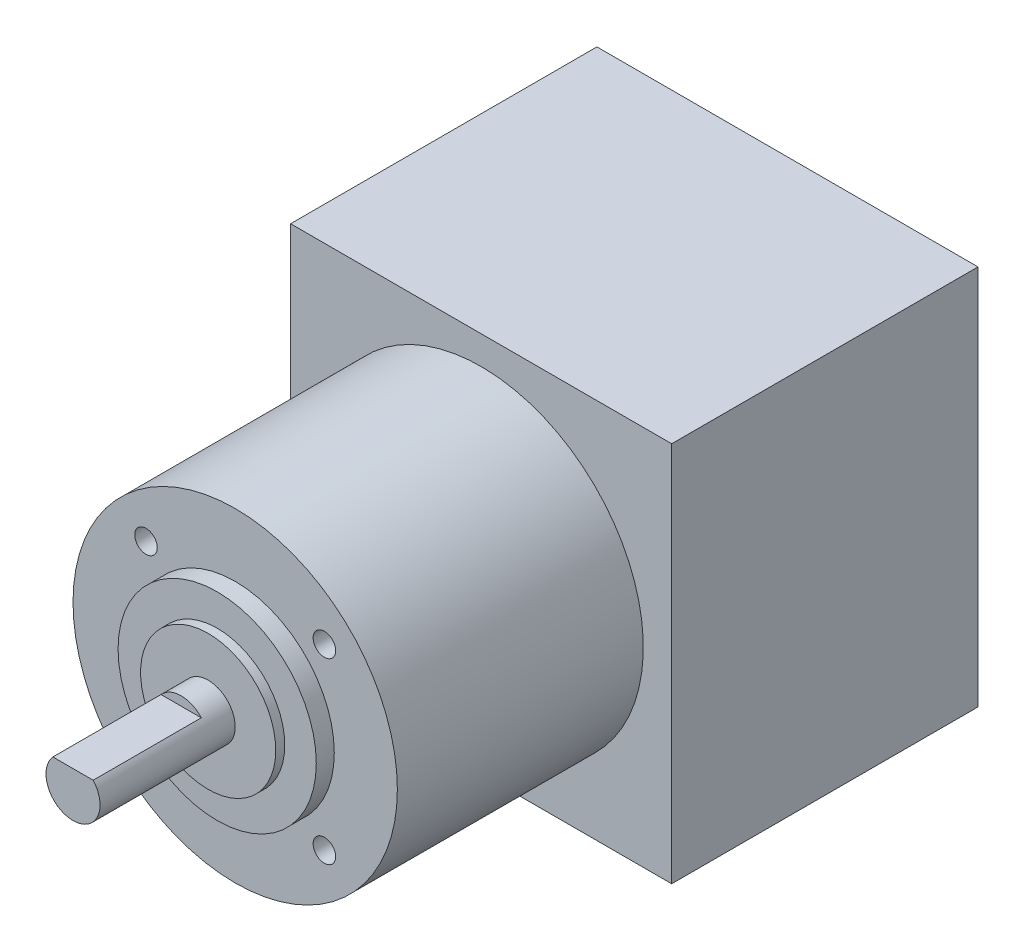
ISO-10303-21;
HEADER;
FILE_DESCRIPTION(('STEP AP214'),'2;1');
FILE_NAME('part.step','',(''),(''),'','','');
FILE_SCHEMA(('AUTOMOTIVE_DESIGN { 1 0 10303 214 1 1 1 1 }'));
ENDSEC;
DATA;
#1=APPLICATION_CONTEXT('core data for automotive mechanical design processes');
#2=APPLICATION_PROTOCOL_DEFINITION('international standard','automotive_design',2000,#1);
#3=PRODUCT_CONTEXT('',#1,'mechanical');
#4=PRODUCT('Part','Part','',(#3));
#5=PRODUCT_RELATED_PRODUCT_CATEGORY('part','',(#4));
#6=PRODUCT_DEFINITION_FORMATION('','',#4);
#7=PRODUCT_DEFINITION_CONTEXT('part definition',#1,'design');
#8=PRODUCT_DEFINITION('design','',#6,#7);
#9=PRODUCT_DEFINITION_SHAPE('','',#8);
#10=(LENGTH_UNIT() NAMED_UNIT(*) SI_UNIT(.MILLI.,.METRE.));
#11=(NAMED_UNIT(*) PLANE_ANGLE_UNIT() SI_UNIT($,.RADIAN.));
#12=(NAMED_UNIT(*) SI_UNIT($,.STERADIAN.) SOLID_ANGLE_UNIT());
#13=UNCERTAINTY_MEASURE_WITH_UNIT(LENGTH_MEASURE(1.E-05),#10,'distance_accuracy_value','');
#14=(GEOMETRIC_REPRESENTATION_CONTEXT(3) GLOBAL_UNCERTAINTY_ASSIGNED_CONTEXT((#13)) GLOBAL_UNIT_ASSIGNED_CONTEXT((#10,
#11,#12)) REPRESENTATION_CONTEXT('',''));
#15=CARTESIAN_POINT('',(0.,0.,0.));
#16=DIRECTION('',(0.,0.,1.));
#17=DIRECTION('',(1.,0.,0.));
#18=AXIS2_PLACEMENT_3D('',#15,#16,#17);
#19=CARTESIAN_POINT('',(0.,0.,34.));
#20=DIRECTION('',(0.,1.,0.));
#21=DIRECTION('',(0.,0.,1.));
#22=AXIS2_PLACEMENT_3D('',#19,#20,#21);
#23=PLANE('',#22);
#24=DIRECTION('',(1.,0.,0.));
#25=VECTOR('',#24,1.);
#26=CARTESIAN_POINT('',(0.,0.,0.));
#27=LINE('',#26,#25);
#28=CARTESIAN_POINT('',(0.,0.,0.));
#29=VERTEX_POINT('',#28);
#30=CARTESIAN_POINT('',(42.3,0.,0.));
#31=VERTEX_POINT('',#30);
#32=EDGE_CURVE('E190',#29,#31,#27,.T.);
#33=ORIENTED_EDGE('',*,*,#32,.T.);
#34=DIRECTION('',(0.,0.,-1.));
#35=VECTOR('',#34,1.);
#36=CARTESIAN_POINT('',(42.3,0.,34.));
#37=LINE('',#36,#35);
#38=CARTESIAN_POINT('',(42.3,0.,34.));
#39=VERTEX_POINT('',#38);
#40=EDGE_CURVE('E198',#39,#31,#37,.T.);
#41=ORIENTED_EDGE('',*,*,#40,.F.);
#42=DIRECTION('',(1.,0.,0.));
#43=VECTOR('',#42,1.);
#44=CARTESIAN_POINT('',(0.,0.,34.));
#45=LINE('',#44,#43);
#46=CARTESIAN_POINT('',(0.,0.,34.));
#47=VERTEX_POINT('',#46);
#48=EDGE_CURVE('E92',#47,#39,#45,.T.);
#49=ORIENTED_EDGE('',*,*,#48,.F.);
#50=DIRECTION('',(0.,0.,-1.));
#51=VECTOR('',#50,1.);
#52=CARTESIAN_POINT('',(0.,0.,34.));
#53=LINE('',#52,#51);
#54=EDGE_CURVE('E201',#47,#29,#53,.T.);
#55=ORIENTED_EDGE('',*,*,#54,.T.);
#56=EDGE_LOOP('',(#33,#41,#49,#55));
#57=FACE_BOUND('',#56,.T.);
#58=CARTESIAN_POINT('',(21.15,0.,10.));
#59=DIRECTION('',(0.,1.,0.));
#60=DIRECTION('',(0.,0.,1.));
#61=AXIS2_PLACEMENT_3D('',#58,#59,#60);
#62=CIRCLE('',#61,5.5);
#63=CARTESIAN_POINT('',(21.15,0.,15.5));
#64=VERTEX_POINT('',#63);
#65=EDGE_CURVE('E11',#64,#64,#62,.F.);
#66=ORIENTED_EDGE('',*,*,#65,.F.);
#67=EDGE_LOOP('',(#66));
#68=FACE_BOUND('',#67,.T.);
#69=ADVANCED_FACE('F39',(#57,#68),#23,.F.);
#70=CARTESIAN_POINT('',(21.15,21.15,64.3));
#71=DIRECTION('',(0.,0.,1.));
#72=DIRECTION('',(1.,0.,0.));
#73=AXIS2_PLACEMENT_3D('',#70,#71,#72);
#74=PLANE('',#73);
#75=CARTESIAN_POINT('',(21.15,21.15,64.3));
#76=DIRECTION('',(0.,0.,1.));
#77=DIRECTION('',(1.,0.,0.));
#78=AXIS2_PLACEMENT_3D('',#75,#76,#77);
#79=CIRCLE('',#78,7.5);
#80=CARTESIAN_POINT('',(28.65,21.15,64.3));
#81=VERTEX_POINT('',#80);
#82=EDGE_CURVE('E166',#81,#81,#79,.T.);
#83=ORIENTED_EDGE('',*,*,#82,.T.);
#84=EDGE_LOOP('',(#83));
#85=FACE_BOUND('',#84,.T.);
#86=CARTESIAN_POINT('',(21.15,21.15,64.3));
#87=DIRECTION('',(0.,0.,1.));
#88=DIRECTION('',(1.,0.,0.));
#89=AXIS2_PLACEMENT_3D('',#86,#87,#88);
#90=CIRCLE('',#89,3.);
#91=CARTESIAN_POINT('',(24.15,21.15,64.3));
#92=VERTEX_POINT('',#91);
#93=EDGE_CURVE('E158',#92,#92,#90,.T.);
#94=ORIENTED_EDGE('',*,*,#93,.F.);
#95=EDGE_LOOP('',(#94));
#96=FACE_BOUND('',#95,.T.);
#97=ADVANCED_FACE('F223',(#85,#96),#74,.T.);
#98=CARTESIAN_POINT('',(21.15,21.15,63.3));
#99=DIRECTION('',(0.,0.,1.));
#100=DIRECTION('',(1.,0.,0.));
#101=AXIS2_PLACEMENT_3D('',#98,#99,#100);
#102=PLANE('',#101);
#103=CARTESIAN_POINT('',(21.15,21.15,63.3));
#104=DIRECTION('',(0.,0.,1.));
#105=DIRECTION('',(1.,0.,0.));
#106=AXIS2_PLACEMENT_3D('',#103,#104,#105);
#107=CIRCLE('',#106,11.);
#108=CARTESIAN_POINT('',(32.15,21.15,63.3));
#109=VERTEX_POINT('',#108);
#110=EDGE_CURVE('E172',#109,#109,#107,.T.);
#111=ORIENTED_EDGE('',*,*,#110,.T.);
#112=EDGE_LOOP('',(#111));
#113=FACE_BOUND('',#112,.T.);
#114=CARTESIAN_POINT('',(21.15,21.15,63.3));
#115=DIRECTION('',(0.,0.,1.));
#116=DIRECTION('',(1.,0.,0.));
#117=AXIS2_PLACEMENT_3D('',#114,#115,#116);
#118=CIRCLE('',#117,7.5);
#119=CARTESIAN_POINT('',(28.65,21.15,63.3));
#120=VERTEX_POINT('',#119);
#121=EDGE_CURVE('E163',#120,#120,#118,.T.);
#122=ORIENTED_EDGE('',*,*,#121,.F.);
#123=EDGE_LOOP('',(#122));
#124=FACE_BOUND('',#123,.T.);
#125=ADVANCED_FACE('F217',(#113,#124),#102,.T.);
#126=CARTESIAN_POINT('',(21.15,21.15,61.3));
#127=DIRECTION('',(0.,0.,1.));
#128=DIRECTION('',(1.,0.,0.));
#129=AXIS2_PLACEMENT_3D('',#126,#127,#128);
#130=PLANE('',#129);
#131=CARTESIAN_POINT('',(11.2505050633883,11.2505050633883,61.3));
#132=DIRECTION('',(0.,0.,1.));
#133=DIRECTION('',(1.,0.,0.));
#134=AXIS2_PLACEMENT_3D('',#131,#132,#133);
#135=CIRCLE('',#134,1.25);
#136=CARTESIAN_POINT('',(12.5005050633883,11.2505050633883,61.3));
#137=VERTEX_POINT('',#136);
#138=EDGE_CURVE('E124',#137,#137,#135,.T.);
#139=ORIENTED_EDGE('',*,*,#138,.F.);
#140=EDGE_LOOP('',(#139));
#141=FACE_BOUND('',#140,.T.);
#142=CARTESIAN_POINT('',(31.0494949366117,11.2505050633883,61.3));
#143=DIRECTION('',(0.,0.,1.));
#144=DIRECTION('',(1.,0.,0.));
#145=AXIS2_PLACEMENT_3D('',#142,#143,#144);
#146=CIRCLE('',#145,1.25);
#147=CARTESIAN_POINT('',(32.2994949366117,11.2505050633883,61.3));
#148=VERTEX_POINT('',#147);
#149=EDGE_CURVE('E123',#148,#148,#146,.T.);
#150=ORIENTED_EDGE('',*,*,#149,.F.);
#151=EDGE_LOOP('',(#150));
#152=FACE_BOUND('',#151,.T.);
#153=CARTESIAN_POINT('',(31.0494949366117,31.0494949366117,61.3));
#154=DIRECTION('',(0.,0.,1.));
#155=DIRECTION('',(1.,0.,0.));
#156=AXIS2_PLACEMENT_3D('',#153,#154,#155);
#157=CIRCLE('',#156,1.25);
#158=CARTESIAN_POINT('',(32.2994949366117,31.0494949366117,61.3));
#159=VERTEX_POINT('',#158);
#160=EDGE_CURVE('E136',#159,#159,#157,.T.);
#161=ORIENTED_EDGE('',*,*,#160,.F.);
#162=EDGE_LOOP('',(#161));
#163=FACE_BOUND('',#162,.T.);
#164=CARTESIAN_POINT('',(11.2505050633883,31.0494949366117,61.3));
#165=DIRECTION('',(0.,0.,1.));
#166=DIRECTION('',(1.,0.,0.));
#167=AXIS2_PLACEMENT_3D('',#164,#165,#166);
#168=CIRCLE('',#167,1.25);
#169=CARTESIAN_POINT('',(12.5005050633883,31.0494949366117,61.3));
#170=VERTEX_POINT('',#169);
#171=EDGE_CURVE('E142',#170,#170,#168,.T.);
#172=ORIENTED_EDGE('',*,*,#171,.F.);
#173=EDGE_LOOP('',(#172));
#174=FACE_BOUND('',#173,.T.);
#175=CARTESIAN_POINT('',(21.15,21.15,61.3));
#176=DIRECTION('',(0.,0.,1.));
#177=DIRECTION('',(1.,0.,0.));
#178=AXIS2_PLACEMENT_3D('',#175,#176,#177);
#179=CIRCLE('',#178,18.);
#180=CARTESIAN_POINT('',(39.15,21.15,61.3));
#181=VERTEX_POINT('',#180);
#182=EDGE_CURVE('E175',#181,#181,#179,.T.);
#183=ORIENTED_EDGE('',*,*,#182,.T.);
#184=EDGE_LOOP('',(#183));
#185=FACE_BOUND('',#184,.T.);
#186=CARTESIAN_POINT('',(21.15,21.15,61.3));
#187=DIRECTION('',(0.,0.,1.));
#188=DIRECTION('',(1.,0.,0.));
#189=AXIS2_PLACEMENT_3D('',#186,#187,#188);
#190=CIRCLE('',#189,11.);
#191=CARTESIAN_POINT('',(32.15,21.15,61.3));
#192=VERTEX_POINT('',#191);
#193=EDGE_CURVE('E169',#192,#192,#190,.T.);
#194=ORIENTED_EDGE('',*,*,#193,.F.);
#195=EDGE_LOOP('',(#194));
#196=FACE_BOUND('',#195,.T.);
#197=ADVANCED_FACE('F209',(#141,#152,#163,#174,#185,#196),#130,.T.);
#198=CARTESIAN_POINT('',(0.,0.,34.));
#199=DIRECTION('',(0.,0.,-1.));
#200=DIRECTION('',(-1.,0.,0.));
#201=AXIS2_PLACEMENT_3D('',#198,#199,#200);
#202=PLANE('',#201);
#203=DIRECTION('',(0.,-1.,0.));
#204=VECTOR('',#203,1.);
#205=CARTESIAN_POINT('',(0.,0.,34.));
#206=LINE('',#205,#204);
#207=CARTESIAN_POINT('',(0.,42.3,34.));
#208=VERTEX_POINT('',#207);
#209=EDGE_CURVE('E181',#208,#47,#206,.T.);
#210=ORIENTED_EDGE('',*,*,#209,.T.);
#211=ORIENTED_EDGE('',*,*,#48,.T.);
#212=DIRECTION('',(0.,1.,0.));
#213=VECTOR('',#212,1.);
#214=CARTESIAN_POINT('',(42.3,0.,34.));
#215=LINE('',#214,#213);
#216=CARTESIAN_POINT('',(42.3,42.3,34.));
#217=VERTEX_POINT('',#216);
#218=EDGE_CURVE('E184',#39,#217,#215,.T.);
#219=ORIENTED_EDGE('',*,*,#218,.T.);
#220=DIRECTION('',(-1.,0.,0.));
#221=VECTOR('',#220,1.);
#222=CARTESIAN_POINT('',(0.,42.3,34.));
#223=LINE('',#222,#221);
#224=EDGE_CURVE('E63',#217,#208,#223,.T.);
#225=ORIENTED_EDGE('',*,*,#224,.T.);
#226=EDGE_LOOP('',(#210,#211,#219,#225));
#227=FACE_BOUND('',#226,.T.);
#228=CARTESIAN_POINT('',(21.15,21.15,34.));
#229=DIRECTION('',(0.,0.,-1.));
#230=DIRECTION('',(-1.,0.,0.));
#231=AXIS2_PLACEMENT_3D('',#228,#229,#230);
#232=CIRCLE('',#231,18.);
#233=CARTESIAN_POINT('',(3.15,21.15,34.));
#234=VERTEX_POINT('',#233);
#235=EDGE_CURVE('E47',#234,#234,#232,.F.);
#236=ORIENTED_EDGE('',*,*,#235,.F.);
#237=EDGE_LOOP('',(#236));
#238=FACE_BOUND('',#237,.T.);
#239=ADVANCED_FACE('F207',(#227,#238),#202,.F.);
#240=CARTESIAN_POINT('',(0.,0.,34.));
#241=DIRECTION('',(1.,0.,0.));
#242=DIRECTION('',(0.,0.,-1.));
#243=AXIS2_PLACEMENT_3D('',#240,#241,#242);
#244=PLANE('',#243);
#245=DIRECTION('',(0.,-1.,0.));
#246=VECTOR('',#245,1.);
#247=CARTESIAN_POINT('',(0.,0.,0.));
#248=LINE('',#247,#246);
#249=CARTESIAN_POINT('',(0.,42.3,0.));
#250=VERTEX_POINT('',#249);
#251=EDGE_CURVE('E180',#250,#29,#248,.T.);
#252=ORIENTED_EDGE('',*,*,#251,.T.);
#253=ORIENTED_EDGE('',*,*,#54,.F.);
#254=ORIENTED_EDGE('',*,*,#209,.F.);
#255=DIRECTION('',(0.,0.,-1.));
#256=VECTOR('',#255,1.);
#257=CARTESIAN_POINT('',(0.,42.3,34.));
#258=LINE('',#257,#256);
#259=EDGE_CURVE('E187',#208,#250,#258,.T.);
#260=ORIENTED_EDGE('',*,*,#259,.T.);
#261=EDGE_LOOP('',(#252,#253,#254,#260));
#262=FACE_BOUND('',#261,.T.);
#263=ADVANCED_FACE('F41',(#262),#244,.F.);
#264=CARTESIAN_POINT('',(42.3,0.,34.));
#265=DIRECTION('',(-1.,0.,0.));
#266=DIRECTION('',(0.,0.,1.));
#267=AXIS2_PLACEMENT_3D('',#264,#265,#266);
#268=PLANE('',#267);
#269=DIRECTION('',(0.,1.,0.));
#270=VECTOR('',#269,1.);
#271=CARTESIAN_POINT('',(42.3,0.,0.));
#272=LINE('',#271,#270);
#273=CARTESIAN_POINT('',(42.3,42.3,0.));
#274=VERTEX_POINT('',#273);
#275=EDGE_CURVE('E192',#31,#274,#272,.T.);
#276=ORIENTED_EDGE('',*,*,#275,.T.);
#277=DIRECTION('',(0.,0.,-1.));
#278=VECTOR('',#277,1.);
#279=CARTESIAN_POINT('',(42.3,42.3,34.));
#280=LINE('',#279,#278);
#281=EDGE_CURVE('E196',#217,#274,#280,.T.);
#282=ORIENTED_EDGE('',*,*,#281,.F.);
#283=ORIENTED_EDGE('',*,*,#218,.F.);
#284=ORIENTED_EDGE('',*,*,#40,.T.);
#285=EDGE_LOOP('',(#276,#282,#283,#284));
#286=FACE_BOUND('',#285,.T.);
#287=ADVANCED_FACE('F215',(#286),#268,.F.);
#288=CARTESIAN_POINT('',(0.,42.3,34.));
#289=DIRECTION('',(0.,-1.,0.));
#290=DIRECTION('',(0.,0.,-1.));
#291=AXIS2_PLACEMENT_3D('',#288,#289,#290);
#292=PLANE('',#291);
#293=DIRECTION('',(-1.,0.,0.));
#294=VECTOR('',#293,1.);
#295=CARTESIAN_POINT('',(0.,42.3,0.));
#296=LINE('',#295,#294);
#297=EDGE_CURVE('E84',#274,#250,#296,.T.);
#298=ORIENTED_EDGE('',*,*,#297,.T.);
#299=ORIENTED_EDGE('',*,*,#259,.F.);
#300=ORIENTED_EDGE('',*,*,#224,.F.);
#301=ORIENTED_EDGE('',*,*,#281,.T.);
#302=EDGE_LOOP('',(#298,#299,#300,#301));
#303=FACE_BOUND('',#302,.T.);
#304=ADVANCED_FACE('F233',(#303),#292,.F.);
#305=CARTESIAN_POINT('',(0.,0.,0.));
#306=DIRECTION('',(0.,0.,-1.));
#307=DIRECTION('',(-1.,0.,0.));
#308=AXIS2_PLACEMENT_3D('',#305,#306,#307);
#309=PLANE('',#308);
#310=ORIENTED_EDGE('',*,*,#251,.F.);
#311=ORIENTED_EDGE('',*,*,#297,.F.);
#312=ORIENTED_EDGE('',*,*,#275,.F.);
#313=ORIENTED_EDGE('',*,*,#32,.F.);
#314=EDGE_LOOP('',(#310,#311,#312,#313));
#315=FACE_BOUND('',#314,.T.);
#316=ADVANCED_FACE('F236',(#315),#309,.T.);
#317=CARTESIAN_POINT('',(21.15,21.15,61.3));
#318=DIRECTION('',(0.,0.,-1.));
#319=DIRECTION('',(-1.,0.,0.));
#320=AXIS2_PLACEMENT_3D('',#317,#318,#319);
#321=CYLINDRICAL_SURFACE('',#320,18.);
#322=ORIENTED_EDGE('',*,*,#182,.F.);
#323=EDGE_LOOP('',(#322));
#324=FACE_BOUND('',#323,.T.);
#325=ORIENTED_EDGE('',*,*,#235,.T.);
#326=EDGE_LOOP('',(#325));
#327=FACE_BOUND('',#326,.T.);
#328=ADVANCED_FACE('F205',(#324,#327),#321,.T.);
#329=CARTESIAN_POINT('',(21.15,21.15,63.3));
#330=DIRECTION('',(0.,0.,-1.));
#331=DIRECTION('',(-1.,0.,0.));
#332=AXIS2_PLACEMENT_3D('',#329,#330,#331);
#333=CYLINDRICAL_SURFACE('',#332,11.);
#334=ORIENTED_EDGE('',*,*,#110,.F.);
#335=EDGE_LOOP('',(#334));
#336=FACE_BOUND('',#335,.T.);
#337=ORIENTED_EDGE('',*,*,#193,.T.);
#338=EDGE_LOOP('',(#337));
#339=FACE_BOUND('',#338,.T.);
#340=ADVANCED_FACE('F242',(#336,#339),#333,.T.);
#341=CARTESIAN_POINT('',(21.15,21.15,64.3));
#342=DIRECTION('',(0.,0.,-1.));
#343=DIRECTION('',(-1.,0.,0.));
#344=AXIS2_PLACEMENT_3D('',#341,#342,#343);
#345=CYLINDRICAL_SURFACE('',#344,7.5);
#346=ORIENTED_EDGE('',*,*,#82,.F.);
#347=EDGE_LOOP('',(#346));
#348=FACE_BOUND('',#347,.T.);
#349=ORIENTED_EDGE('',*,*,#121,.T.);
#350=EDGE_LOOP('',(#349));
#351=FACE_BOUND('',#350,.T.);
#352=ADVANCED_FACE('F253',(#348,#351),#345,.T.);
#353=CARTESIAN_POINT('',(21.15,21.15,79.3));
#354=DIRECTION('',(0.,0.,-1.));
#355=DIRECTION('',(-1.,0.,0.));
#356=AXIS2_PLACEMENT_3D('',#353,#354,#355);
#357=CYLINDRICAL_SURFACE('',#356,3.);
#358=CARTESIAN_POINT('',(21.15,21.15,79.3));
#359=DIRECTION('',(0.,0.,1.));
#360=DIRECTION('',(1.,0.,0.));
#361=AXIS2_PLACEMENT_3D('',#358,#359,#360);
#362=CIRCLE('',#361,3.);
#363=CARTESIAN_POINT('',(18.9139320225002,23.15,79.3));
#364=VERTEX_POINT('',#363);
#365=CARTESIAN_POINT('',(23.3860679774998,23.15,79.3));
#366=VERTEX_POINT('',#365);
#367=EDGE_CURVE('E160',#364,#366,#362,.T.);
#368=ORIENTED_EDGE('',*,*,#367,.F.);
#369=DIRECTION('',(0.,0.,1.));
#370=VECTOR('',#369,1.);
#371=CARTESIAN_POINT('',(18.9139320225002,23.15,67.3));
#372=LINE('',#371,#370);
#373=CARTESIAN_POINT('',(18.9139320225002,23.15,67.3));
#374=VERTEX_POINT('',#373);
#375=EDGE_CURVE('E54',#374,#364,#372,.T.);
#376=ORIENTED_EDGE('',*,*,#375,.F.);
#377=CARTESIAN_POINT('',(21.15,21.15,67.3));
#378=DIRECTION('',(0.,0.,1.));
#379=DIRECTION('',(1.,0.,0.));
#380=AXIS2_PLACEMENT_3D('',#377,#378,#379);
#381=CIRCLE('',#380,3.);
#382=CARTESIAN_POINT('',(23.3860679774998,23.15,67.3));
#383=VERTEX_POINT('',#382);
#384=EDGE_CURVE('E149',#383,#374,#381,.T.);
#385=ORIENTED_EDGE('',*,*,#384,.F.);
#386=DIRECTION('',(0.,0.,1.));
#387=VECTOR('',#386,1.);
#388=CARTESIAN_POINT('',(23.3860679774998,23.15,67.3));
#389=LINE('',#388,#387);
#390=EDGE_CURVE('E155',#383,#366,#389,.T.);
#391=ORIENTED_EDGE('',*,*,#390,.T.);
#392=EDGE_LOOP('',(#368,#376,#385,#391));
#393=FACE_BOUND('',#392,.T.);
#394=ORIENTED_EDGE('',*,*,#93,.T.);
#395=EDGE_LOOP('',(#394));
#396=FACE_BOUND('',#395,.T.);
#397=ADVANCED_FACE('F262',(#393,#396),#357,.T.);
#398=CARTESIAN_POINT('',(21.15,21.15,79.3));
#399=DIRECTION('',(0.,0.,1.));
#400=DIRECTION('',(1.,0.,0.));
#401=AXIS2_PLACEMENT_3D('',#398,#399,#400);
#402=PLANE('',#401);
#403=DIRECTION('',(1.,0.,0.));
#404=VECTOR('',#403,1.);
#405=CARTESIAN_POINT('',(23.3860679774998,23.15,79.3));
#406=LINE('',#405,#404);
#407=EDGE_CURVE('E148',#364,#366,#406,.T.);
#408=ORIENTED_EDGE('',*,*,#407,.F.);
#409=ORIENTED_EDGE('',*,*,#367,.T.);
#410=EDGE_LOOP('',(#408,#409));
#411=FACE_BOUND('',#410,.T.);
#412=ADVANCED_FACE('F267',(#411),#402,.T.);
#413=CARTESIAN_POINT('',(23.3860679774998,23.15,67.3));
#414=DIRECTION('',(0.,-1.,0.));
#415=DIRECTION('',(1.,0.,0.));
#416=AXIS2_PLACEMENT_3D('',#413,#414,#415);
#417=PLANE('',#416);
#418=ORIENTED_EDGE('',*,*,#407,.T.);
#419=ORIENTED_EDGE('',*,*,#390,.F.);
#420=DIRECTION('',(1.,0.,0.));
#421=VECTOR('',#420,1.);
#422=CARTESIAN_POINT('',(23.3860679774998,23.15,67.3));
#423=LINE('',#422,#421);
#424=EDGE_CURVE('E151',#374,#383,#423,.T.);
#425=ORIENTED_EDGE('',*,*,#424,.F.);
#426=ORIENTED_EDGE('',*,*,#375,.T.);
#427=EDGE_LOOP('',(#418,#419,#425,#426));
#428=FACE_BOUND('',#427,.T.);
#429=ADVANCED_FACE('F271',(#428),#417,.F.);
#430=CARTESIAN_POINT('',(21.15,21.15,67.3));
#431=DIRECTION('',(0.,0.,1.));
#432=DIRECTION('',(1.,0.,0.));
#433=AXIS2_PLACEMENT_3D('',#430,#431,#432);
#434=PLANE('',#433);
#435=ORIENTED_EDGE('',*,*,#384,.T.);
#436=ORIENTED_EDGE('',*,*,#424,.T.);
#437=EDGE_LOOP('',(#435,#436));
#438=FACE_BOUND('',#437,.T.);
#439=ADVANCED_FACE('F275',(#438),#434,.T.);
#440=CARTESIAN_POINT('',(11.2505050633883,31.0494949366117,52.8));
#441=DIRECTION('',(0.,0.,1.));
#442=DIRECTION('',(1.,0.,0.));
#443=AXIS2_PLACEMENT_3D('',#440,#441,#442);
#444=CONICAL_SURFACE('',#443,1.25,1.02974425867665);
#445=CARTESIAN_POINT('',(11.2505050633883,31.0494949366117,52.0489242262156));
#446=VERTEX_POINT('',#445);
#447=VERTEX_LOOP('',#446);
#448=FACE_BOUND('',#447,.T.);
#449=CARTESIAN_POINT('',(11.2505050633883,31.0494949366117,52.8));
#450=DIRECTION('',(0.,0.,1.));
#451=DIRECTION('',(1.,0.,0.));
#452=AXIS2_PLACEMENT_3D('',#449,#450,#451);
#453=CIRCLE('',#452,1.25);
#454=CARTESIAN_POINT('',(12.5005050633883,31.0494949366117,52.8));
#455=VERTEX_POINT('',#454);
#456=EDGE_CURVE('E145',#455,#455,#453,.T.);
#457=ORIENTED_EDGE('',*,*,#456,.T.);
#458=EDGE_LOOP('',(#457));
#459=FACE_BOUND('',#458,.T.);
#460=ADVANCED_FACE('F278',(#448,#459),#444,.F.);
#461=CARTESIAN_POINT('',(11.2505050633883,31.0494949366117,61.3));
#462=DIRECTION('',(0.,0.,1.));
#463=DIRECTION('',(1.,0.,0.));
#464=AXIS2_PLACEMENT_3D('',#461,#462,#463);
#465=CYLINDRICAL_SURFACE('',#464,1.25);
#466=ORIENTED_EDGE('',*,*,#456,.F.);
#467=EDGE_LOOP('',(#466));
#468=FACE_BOUND('',#467,.T.);
#469=ORIENTED_EDGE('',*,*,#171,.T.);
#470=EDGE_LOOP('',(#469));
#471=FACE_BOUND('',#470,.T.);
#472=ADVANCED_FACE('F282',(#468,#471),#465,.F.);
#473=CARTESIAN_POINT('',(31.0494949366117,31.0494949366117,52.8));
#474=DIRECTION('',(0.,0.,1.));
#475=DIRECTION('',(1.,0.,0.));
#476=AXIS2_PLACEMENT_3D('',#473,#474,#475);
#477=CONICAL_SURFACE('',#476,1.24999999999999,1.02974425867665);
#478=CARTESIAN_POINT('',(31.0494949366117,31.0494949366117,52.0489242262156));
#479=VERTEX_POINT('',#478);
#480=VERTEX_LOOP('',#479);
#481=FACE_BOUND('',#480,.T.);
#482=CARTESIAN_POINT('',(31.0494949366117,31.0494949366117,52.8));
#483=DIRECTION('',(0.,0.,1.));
#484=DIRECTION('',(1.,0.,0.));
#485=AXIS2_PLACEMENT_3D('',#482,#483,#484);
#486=CIRCLE('',#485,1.24999999999999);
#487=CARTESIAN_POINT('',(32.2994949366117,31.0494949366117,52.8));
#488=VERTEX_POINT('',#487);
#489=EDGE_CURVE('E139',#488,#488,#486,.T.);
#490=ORIENTED_EDGE('',*,*,#489,.T.);
#491=EDGE_LOOP('',(#490));
#492=FACE_BOUND('',#491,.T.);
#493=ADVANCED_FACE('F286',(#481,#492),#477,.F.);
#494=CARTESIAN_POINT('',(31.0494949366117,31.0494949366117,61.3));
#495=DIRECTION('',(0.,0.,1.));
#496=DIRECTION('',(1.,0.,0.));
#497=AXIS2_PLACEMENT_3D('',#494,#495,#496);
#498=CYLINDRICAL_SURFACE('',#497,1.25);
#499=ORIENTED_EDGE('',*,*,#489,.F.);
#500=EDGE_LOOP('',(#499));
#501=FACE_BOUND('',#500,.T.);
#502=ORIENTED_EDGE('',*,*,#160,.T.);
#503=EDGE_LOOP('',(#502));
#504=FACE_BOUND('',#503,.T.);
#505=ADVANCED_FACE('F290',(#501,#504),#498,.F.);
#506=CARTESIAN_POINT('',(31.0494949366117,11.2505050633883,52.8));
#507=DIRECTION('',(0.,0.,1.));
#508=DIRECTION('',(1.,0.,0.));
#509=AXIS2_PLACEMENT_3D('',#506,#507,#508);
#510=CONICAL_SURFACE('',#509,1.24999999999999,1.02974425867665);
#511=CARTESIAN_POINT('',(31.0494949366117,11.2505050633883,52.0489242262156));
#512=VERTEX_POINT('',#511);
#513=VERTEX_LOOP('',#512);
#514=FACE_BOUND('',#513,.T.);
#515=CARTESIAN_POINT('',(31.0494949366117,11.2505050633883,52.8));
#516=DIRECTION('',(0.,0.,1.));
#517=DIRECTION('',(1.,0.,0.));
#518=AXIS2_PLACEMENT_3D('',#515,#516,#517);
#519=CIRCLE('',#518,1.24999999999999);
#520=CARTESIAN_POINT('',(32.2994949366117,11.2505050633883,52.8));
#521=VERTEX_POINT('',#520);
#522=EDGE_CURVE('E127',#521,#521,#519,.T.);
#523=ORIENTED_EDGE('',*,*,#522,.T.);
#524=EDGE_LOOP('',(#523));
#525=FACE_BOUND('',#524,.T.);
#526=ADVANCED_FACE('F294',(#514,#525),#510,.F.);
#527=CARTESIAN_POINT('',(31.0494949366117,11.2505050633883,61.3));
#528=DIRECTION('',(0.,0.,1.));
#529=DIRECTION('',(1.,0.,0.));
#530=AXIS2_PLACEMENT_3D('',#527,#528,#529);
#531=CYLINDRICAL_SURFACE('',#530,1.25);
#532=ORIENTED_EDGE('',*,*,#522,.F.);
#533=EDGE_LOOP('',(#532));
#534=FACE_BOUND('',#533,.T.);
#535=ORIENTED_EDGE('',*,*,#149,.T.);
#536=EDGE_LOOP('',(#535));
#537=FACE_BOUND('',#536,.T.);
#538=ADVANCED_FACE('F117',(#534,#537),#531,.F.);
#539=CARTESIAN_POINT('',(11.2505050633883,11.2505050633883,52.8));
#540=DIRECTION('',(0.,0.,1.));
#541=DIRECTION('',(1.,0.,0.));
#542=AXIS2_PLACEMENT_3D('',#539,#540,#541);
#543=CONICAL_SURFACE('',#542,1.25,1.02974425867665);
#544=CARTESIAN_POINT('',(11.2505050633883,11.2505050633883,52.0489242262156));
#545=VERTEX_POINT('',#544);
#546=VERTEX_LOOP('',#545);
#547=FACE_BOUND('',#546,.T.);
#548=CARTESIAN_POINT('',(11.2505050633883,11.2505050633883,52.8));
#549=DIRECTION('',(0.,0.,1.));
#550=DIRECTION('',(1.,0.,0.));
#551=AXIS2_PLACEMENT_3D('',#548,#549,#550);
#552=CIRCLE('',#551,1.25);
#553=CARTESIAN_POINT('',(12.5005050633883,11.2505050633883,52.8));
#554=VERTEX_POINT('',#553);
#555=EDGE_CURVE('E121',#554,#554,#552,.T.);
#556=ORIENTED_EDGE('',*,*,#555,.T.);
#557=EDGE_LOOP('',(#556));
#558=FACE_BOUND('',#557,.T.);
#559=ADVANCED_FACE('F113',(#547,#558),#543,.F.);
#560=CARTESIAN_POINT('',(11.2505050633883,11.2505050633883,61.3));
#561=DIRECTION('',(0.,0.,1.));
#562=DIRECTION('',(1.,0.,0.));
#563=AXIS2_PLACEMENT_3D('',#560,#561,#562);
#564=CYLINDRICAL_SURFACE('',#563,1.25);
#565=ORIENTED_EDGE('',*,*,#555,.F.);
#566=EDGE_LOOP('',(#565));
#567=FACE_BOUND('',#566,.T.);
#568=ORIENTED_EDGE('',*,*,#138,.T.);
#569=EDGE_LOOP('',(#568));
#570=FACE_BOUND('',#569,.T.);
#571=ADVANCED_FACE('F116',(#567,#570),#564,.F.);
#572=CARTESIAN_POINT('',(21.15,-5.,10.));
#573=DIRECTION('',(0.,1.,0.));
#574=DIRECTION('',(0.,0.,1.));
#575=AXIS2_PLACEMENT_3D('',#572,#573,#574);
#576=CYLINDRICAL_SURFACE('',#575,5.5);
#577=CARTESIAN_POINT('',(21.15,-5.,10.));
#578=DIRECTION('',(0.,-1.,0.));
#579=DIRECTION('',(0.,0.,-1.));
#580=AXIS2_PLACEMENT_3D('',#577,#578,#579);
#581=CIRCLE('',#580,5.5);
#582=CARTESIAN_POINT('',(21.15,-5.,4.5));
#583=VERTEX_POINT('',#582);
#584=EDGE_CURVE('E130',#583,#583,#581,.T.);
#585=ORIENTED_EDGE('',*,*,#584,.F.);
#586=EDGE_LOOP('',(#585));
#587=FACE_BOUND('',#586,.T.);
#588=ORIENTED_EDGE('',*,*,#65,.T.);
#589=EDGE_LOOP('',(#588));
#590=FACE_BOUND('',#589,.T.);
#591=ADVANCED_FACE('F304',(#587,#590),#576,.T.);
#592=CARTESIAN_POINT('',(21.15,-5.,10.));
#593=DIRECTION('',(0.,-1.,0.));
#594=DIRECTION('',(0.,0.,-1.));
#595=AXIS2_PLACEMENT_3D('',#592,#593,#594);
#596=PLANE('',#595);
#597=ORIENTED_EDGE('',*,*,#584,.T.);
#598=EDGE_LOOP('',(#597));
#599=FACE_BOUND('',#598,.T.);
#600=ADVANCED_FACE('F307',(#599),#596,.T.);
#601=CLOSED_SHELL('',(#69,#97,#125,#197,#239,#263,#287,#304,#316,#328,#340,#352,#397,#412,#429,
#439,#460,#472,#493,#505,#526,#538,#559,#571,#591,#600));
#602=MANIFOLD_SOLID_BREP('B2',#601);
#603=ADVANCED_BREP_SHAPE_REPRESENTATION('',(#18,#602),#14);
#604=SHAPE_DEFINITION_REPRESENTATION(#9,#603);
ENDSEC;
END-ISO-10303-21;
